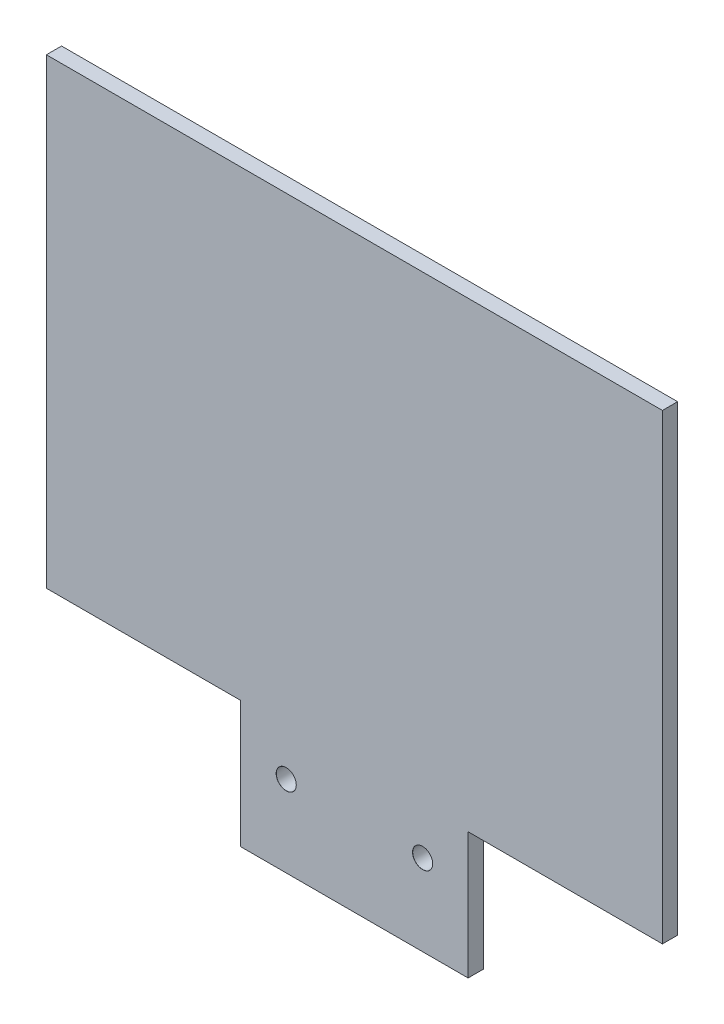
ISO-10303-21;
HEADER;
FILE_DESCRIPTION(('STEP AP214'),'2;1');
FILE_NAME('part.step','',(''),(''),'','','');
FILE_SCHEMA(('AUTOMOTIVE_DESIGN { 1 0 10303 214 1 1 1 1 }'));
ENDSEC;
DATA;
#1=APPLICATION_CONTEXT('core data for automotive mechanical design processes');
#2=APPLICATION_PROTOCOL_DEFINITION('international standard','automotive_design',2000,#1);
#3=PRODUCT_CONTEXT('',#1,'mechanical');
#4=PRODUCT('Part','Part','',(#3));
#5=PRODUCT_RELATED_PRODUCT_CATEGORY('part','',(#4));
#6=PRODUCT_DEFINITION_FORMATION('','',#4);
#7=PRODUCT_DEFINITION_CONTEXT('part definition',#1,'design');
#8=PRODUCT_DEFINITION('design','',#6,#7);
#9=PRODUCT_DEFINITION_SHAPE('','',#8);
#10=(LENGTH_UNIT() NAMED_UNIT(*) SI_UNIT(.MILLI.,.METRE.));
#11=(NAMED_UNIT(*) PLANE_ANGLE_UNIT() SI_UNIT($,.RADIAN.));
#12=(NAMED_UNIT(*) SI_UNIT($,.STERADIAN.) SOLID_ANGLE_UNIT());
#13=UNCERTAINTY_MEASURE_WITH_UNIT(LENGTH_MEASURE(1.E-05),#10,'distance_accuracy_value','');
#14=(GEOMETRIC_REPRESENTATION_CONTEXT(3) GLOBAL_UNCERTAINTY_ASSIGNED_CONTEXT((#13)) GLOBAL_UNIT_ASSIGNED_CONTEXT((#10,
#11,#12)) REPRESENTATION_CONTEXT('',''));
#15=CARTESIAN_POINT('',(0.,0.,0.));
#16=DIRECTION('',(0.,0.,1.));
#17=DIRECTION('',(1.,0.,0.));
#18=AXIS2_PLACEMENT_3D('',#15,#16,#17);
#19=CARTESIAN_POINT('',(0.,20.889,5.));
#20=DIRECTION('',(0.,-1.,0.));
#21=DIRECTION('',(1.,0.,0.));
#22=AXIS2_PLACEMENT_3D('',#19,#20,#21);
#23=PLANE('',#22);
#24=DIRECTION('',(-1.,0.,0.));
#25=VECTOR('',#24,1.);
#26=CARTESIAN_POINT('',(0.,20.889,0.));
#27=LINE('',#26,#25);
#28=CARTESIAN_POINT('',(-37.5,20.889,0.));
#29=VERTEX_POINT('',#28);
#30=CARTESIAN_POINT('',(-101.6,20.889,0.));
#31=VERTEX_POINT('',#30);
#32=EDGE_CURVE('E128',#29,#31,#27,.T.);
#33=ORIENTED_EDGE('',*,*,#32,.F.);
#34=DIRECTION('',(0.,0.,-1.));
#35=VECTOR('',#34,1.);
#36=CARTESIAN_POINT('',(-37.5,20.889,5.));
#37=LINE('',#36,#35);
#38=CARTESIAN_POINT('',(-37.5,20.889,5.));
#39=VERTEX_POINT('',#38);
#40=EDGE_CURVE('E11',#39,#29,#37,.T.);
#41=ORIENTED_EDGE('',*,*,#40,.F.);
#42=DIRECTION('',(-1.,0.,0.));
#43=VECTOR('',#42,1.);
#44=CARTESIAN_POINT('',(0.,20.889,5.));
#45=LINE('',#44,#43);
#46=CARTESIAN_POINT('',(-101.6,20.889,5.));
#47=VERTEX_POINT('',#46);
#48=EDGE_CURVE('E147',#39,#47,#45,.T.);
#49=ORIENTED_EDGE('',*,*,#48,.T.);
#50=DIRECTION('',(0.,0.,-1.));
#51=VECTOR('',#50,1.);
#52=CARTESIAN_POINT('',(-101.6,20.889,5.));
#53=LINE('',#52,#51);
#54=EDGE_CURVE('E86',#47,#31,#53,.T.);
#55=ORIENTED_EDGE('',*,*,#54,.T.);
#56=EDGE_LOOP('',(#33,#41,#49,#55));
#57=FACE_BOUND('',#56,.T.);
#58=ADVANCED_FACE('F36',(#57),#23,.T.);
#59=CARTESIAN_POINT('',(-37.5,0.,5.));
#60=DIRECTION('',(-1.,0.,0.));
#61=DIRECTION('',(0.,0.,1.));
#62=AXIS2_PLACEMENT_3D('',#59,#60,#61);
#63=PLANE('',#62);
#64=DIRECTION('',(0.,1.,0.));
#65=VECTOR('',#64,1.);
#66=CARTESIAN_POINT('',(-37.5,0.,0.));
#67=LINE('',#66,#65);
#68=CARTESIAN_POINT('',(-37.5,-20.889,0.));
#69=VERTEX_POINT('',#68);
#70=EDGE_CURVE('E131',#69,#29,#67,.T.);
#71=ORIENTED_EDGE('',*,*,#70,.F.);
#72=DIRECTION('',(0.,0.,-1.));
#73=VECTOR('',#72,1.);
#74=CARTESIAN_POINT('',(-37.5,-20.889,5.));
#75=LINE('',#74,#73);
#76=CARTESIAN_POINT('',(-37.5,-20.889,5.));
#77=VERTEX_POINT('',#76);
#78=EDGE_CURVE('E44',#77,#69,#75,.T.);
#79=ORIENTED_EDGE('',*,*,#78,.F.);
#80=DIRECTION('',(0.,1.,0.));
#81=VECTOR('',#80,1.);
#82=CARTESIAN_POINT('',(-37.5,0.,5.));
#83=LINE('',#82,#81);
#84=EDGE_CURVE('E171',#77,#39,#83,.T.);
#85=ORIENTED_EDGE('',*,*,#84,.T.);
#86=ORIENTED_EDGE('',*,*,#40,.T.);
#87=EDGE_LOOP('',(#71,#79,#85,#86));
#88=FACE_BOUND('',#87,.T.);
#89=ADVANCED_FACE('F170',(#88),#63,.T.);
#90=CARTESIAN_POINT('',(0.,-20.889,5.));
#91=DIRECTION('',(0.,1.,0.));
#92=DIRECTION('',(0.,0.,1.));
#93=AXIS2_PLACEMENT_3D('',#90,#91,#92);
#94=PLANE('',#93);
#95=DIRECTION('',(1.,0.,0.));
#96=VECTOR('',#95,1.);
#97=CARTESIAN_POINT('',(0.,-20.889,0.));
#98=LINE('',#97,#96);
#99=CARTESIAN_POINT('',(37.5,-20.889,0.));
#100=VERTEX_POINT('',#99);
#101=EDGE_CURVE('E135',#69,#100,#98,.T.);
#102=ORIENTED_EDGE('',*,*,#101,.T.);
#103=DIRECTION('',(0.,0.,-1.));
#104=VECTOR('',#103,1.);
#105=CARTESIAN_POINT('',(37.5,-20.889,5.));
#106=LINE('',#105,#104);
#107=CARTESIAN_POINT('',(37.5,-20.889,5.));
#108=VERTEX_POINT('',#107);
#109=EDGE_CURVE('E154',#108,#100,#106,.T.);
#110=ORIENTED_EDGE('',*,*,#109,.F.);
#111=DIRECTION('',(1.,0.,0.));
#112=VECTOR('',#111,1.);
#113=CARTESIAN_POINT('',(0.,-20.889,5.));
#114=LINE('',#113,#112);
#115=EDGE_CURVE('E161',#77,#108,#114,.T.);
#116=ORIENTED_EDGE('',*,*,#115,.F.);
#117=ORIENTED_EDGE('',*,*,#78,.T.);
#118=EDGE_LOOP('',(#102,#110,#116,#117));
#119=FACE_BOUND('',#118,.T.);
#120=ADVANCED_FACE('F159',(#119),#94,.F.);
#121=CARTESIAN_POINT('',(37.5,0.,5.));
#122=DIRECTION('',(-1.,0.,0.));
#123=DIRECTION('',(0.,-1.,0.));
#124=AXIS2_PLACEMENT_3D('',#121,#122,#123);
#125=PLANE('',#124);
#126=DIRECTION('',(0.,1.,0.));
#127=VECTOR('',#126,1.);
#128=CARTESIAN_POINT('',(37.5,0.,0.));
#129=LINE('',#128,#127);
#130=CARTESIAN_POINT('',(37.5,20.889,0.));
#131=VERTEX_POINT('',#130);
#132=EDGE_CURVE('E137',#100,#131,#129,.T.);
#133=ORIENTED_EDGE('',*,*,#132,.T.);
#134=DIRECTION('',(0.,0.,-1.));
#135=VECTOR('',#134,1.);
#136=CARTESIAN_POINT('',(37.5,20.889,5.));
#137=LINE('',#136,#135);
#138=CARTESIAN_POINT('',(37.5,20.889,5.));
#139=VERTEX_POINT('',#138);
#140=EDGE_CURVE('E151',#139,#131,#137,.T.);
#141=ORIENTED_EDGE('',*,*,#140,.F.);
#142=DIRECTION('',(0.,1.,0.));
#143=VECTOR('',#142,1.);
#144=CARTESIAN_POINT('',(37.5,0.,5.));
#145=LINE('',#144,#143);
#146=EDGE_CURVE('E179',#108,#139,#145,.T.);
#147=ORIENTED_EDGE('',*,*,#146,.F.);
#148=ORIENTED_EDGE('',*,*,#109,.T.);
#149=EDGE_LOOP('',(#133,#141,#147,#148));
#150=FACE_BOUND('',#149,.T.);
#151=ADVANCED_FACE('F183',(#150),#125,.F.);
#152=CARTESIAN_POINT('',(0.,20.889,5.));
#153=DIRECTION('',(0.,1.,0.));
#154=DIRECTION('',(0.,0.,1.));
#155=AXIS2_PLACEMENT_3D('',#152,#153,#154);
#156=PLANE('',#155);
#157=DIRECTION('',(1.,0.,0.));
#158=VECTOR('',#157,1.);
#159=CARTESIAN_POINT('',(0.,20.889,0.));
#160=LINE('',#159,#158);
#161=CARTESIAN_POINT('',(101.6,20.889,0.));
#162=VERTEX_POINT('',#161);
#163=EDGE_CURVE('E139',#131,#162,#160,.T.);
#164=ORIENTED_EDGE('',*,*,#163,.T.);
#165=DIRECTION('',(0.,0.,-1.));
#166=VECTOR('',#165,1.);
#167=CARTESIAN_POINT('',(101.6,20.889,5.));
#168=LINE('',#167,#166);
#169=CARTESIAN_POINT('',(101.6,20.889,5.));
#170=VERTEX_POINT('',#169);
#171=EDGE_CURVE('E115',#170,#162,#168,.T.);
#172=ORIENTED_EDGE('',*,*,#171,.F.);
#173=DIRECTION('',(1.,0.,0.));
#174=VECTOR('',#173,1.);
#175=CARTESIAN_POINT('',(0.,20.889,5.));
#176=LINE('',#175,#174);
#177=EDGE_CURVE('E120',#139,#170,#176,.T.);
#178=ORIENTED_EDGE('',*,*,#177,.F.);
#179=ORIENTED_EDGE('',*,*,#140,.T.);
#180=EDGE_LOOP('',(#164,#172,#178,#179));
#181=FACE_BOUND('',#180,.T.);
#182=ADVANCED_FACE('F185',(#181),#156,.F.);
#183=CARTESIAN_POINT('',(101.6,0.,5.));
#184=DIRECTION('',(1.,0.,0.));
#185=DIRECTION('',(0.,1.,0.));
#186=AXIS2_PLACEMENT_3D('',#183,#184,#185);
#187=PLANE('',#186);
#188=DIRECTION('',(0.,-1.,0.));
#189=VECTOR('',#188,1.);
#190=CARTESIAN_POINT('',(101.6,0.,0.));
#191=LINE('',#190,#189);
#192=CARTESIAN_POINT('',(101.6,173.289,0.));
#193=VERTEX_POINT('',#192);
#194=EDGE_CURVE('E110',#193,#162,#191,.T.);
#195=ORIENTED_EDGE('',*,*,#194,.F.);
#196=DIRECTION('',(0.,0.,-1.));
#197=VECTOR('',#196,1.);
#198=CARTESIAN_POINT('',(101.6,173.289,5.));
#199=LINE('',#198,#197);
#200=CARTESIAN_POINT('',(101.6,173.289,5.));
#201=VERTEX_POINT('',#200);
#202=EDGE_CURVE('E105',#201,#193,#199,.T.);
#203=ORIENTED_EDGE('',*,*,#202,.F.);
#204=DIRECTION('',(0.,-1.,0.));
#205=VECTOR('',#204,1.);
#206=CARTESIAN_POINT('',(101.6,0.,5.));
#207=LINE('',#206,#205);
#208=EDGE_CURVE('E108',#201,#170,#207,.T.);
#209=ORIENTED_EDGE('',*,*,#208,.T.);
#210=ORIENTED_EDGE('',*,*,#171,.T.);
#211=EDGE_LOOP('',(#195,#203,#209,#210));
#212=FACE_BOUND('',#211,.T.);
#213=ADVANCED_FACE('F107',(#212),#187,.T.);
#214=CARTESIAN_POINT('',(0.,173.289,5.));
#215=DIRECTION('',(0.,1.,0.));
#216=DIRECTION('',(0.,0.,1.));
#217=AXIS2_PLACEMENT_3D('',#214,#215,#216);
#218=PLANE('',#217);
#219=DIRECTION('',(1.,0.,0.));
#220=VECTOR('',#219,1.);
#221=CARTESIAN_POINT('',(0.,173.289,0.));
#222=LINE('',#221,#220);
#223=CARTESIAN_POINT('',(-101.6,173.289,0.));
#224=VERTEX_POINT('',#223);
#225=EDGE_CURVE('E143',#224,#193,#222,.T.);
#226=ORIENTED_EDGE('',*,*,#225,.F.);
#227=DIRECTION('',(0.,0.,-1.));
#228=VECTOR('',#227,1.);
#229=CARTESIAN_POINT('',(-101.6,173.289,5.));
#230=LINE('',#229,#228);
#231=CARTESIAN_POINT('',(-101.6,173.289,5.));
#232=VERTEX_POINT('',#231);
#233=EDGE_CURVE('E79',#232,#224,#230,.T.);
#234=ORIENTED_EDGE('',*,*,#233,.F.);
#235=DIRECTION('',(1.,0.,0.));
#236=VECTOR('',#235,1.);
#237=CARTESIAN_POINT('',(0.,173.289,5.));
#238=LINE('',#237,#236);
#239=EDGE_CURVE('E118',#232,#201,#238,.T.);
#240=ORIENTED_EDGE('',*,*,#239,.T.);
#241=ORIENTED_EDGE('',*,*,#202,.T.);
#242=EDGE_LOOP('',(#226,#234,#240,#241));
#243=FACE_BOUND('',#242,.T.);
#244=ADVANCED_FACE('F123',(#243),#218,.T.);
#245=CARTESIAN_POINT('',(-101.6,0.,5.));
#246=DIRECTION('',(1.,0.,0.));
#247=DIRECTION('',(0.,1.,0.));
#248=AXIS2_PLACEMENT_3D('',#245,#246,#247);
#249=PLANE('',#248);
#250=DIRECTION('',(0.,-1.,0.));
#251=VECTOR('',#250,1.);
#252=CARTESIAN_POINT('',(-101.6,0.,0.));
#253=LINE('',#252,#251);
#254=EDGE_CURVE('E145',#224,#31,#253,.T.);
#255=ORIENTED_EDGE('',*,*,#254,.T.);
#256=ORIENTED_EDGE('',*,*,#54,.F.);
#257=DIRECTION('',(0.,-1.,0.));
#258=VECTOR('',#257,1.);
#259=CARTESIAN_POINT('',(-101.6,0.,5.));
#260=LINE('',#259,#258);
#261=EDGE_CURVE('E52',#232,#47,#260,.T.);
#262=ORIENTED_EDGE('',*,*,#261,.F.);
#263=ORIENTED_EDGE('',*,*,#233,.T.);
#264=EDGE_LOOP('',(#255,#256,#262,#263));
#265=FACE_BOUND('',#264,.T.);
#266=ADVANCED_FACE('F172',(#265),#249,.F.);
#267=CARTESIAN_POINT('',(0.,0.,5.));
#268=DIRECTION('',(0.,0.,1.));
#269=DIRECTION('',(1.,0.,0.));
#270=AXIS2_PLACEMENT_3D('',#267,#268,#269);
#271=PLANE('',#270);
#272=CARTESIAN_POINT('',(-22.5,5.889,5.));
#273=DIRECTION('',(0.,0.,1.));
#274=DIRECTION('',(1.,0.,0.));
#275=AXIS2_PLACEMENT_3D('',#272,#273,#274);
#276=CIRCLE('',#275,3.325);
#277=CARTESIAN_POINT('',(-19.175,5.889,5.));
#278=VERTEX_POINT('',#277);
#279=EDGE_CURVE('E303',#278,#278,#276,.T.);
#280=ORIENTED_EDGE('',*,*,#279,.F.);
#281=EDGE_LOOP('',(#280));
#282=FACE_BOUND('',#281,.T.);
#283=CARTESIAN_POINT('',(22.5,5.889,5.));
#284=DIRECTION('',(0.,0.,1.));
#285=DIRECTION('',(1.,0.,0.));
#286=AXIS2_PLACEMENT_3D('',#283,#284,#285);
#287=CIRCLE('',#286,3.325);
#288=CARTESIAN_POINT('',(25.825,5.889,5.));
#289=VERTEX_POINT('',#288);
#290=EDGE_CURVE('E310',#289,#289,#287,.T.);
#291=ORIENTED_EDGE('',*,*,#290,.F.);
#292=EDGE_LOOP('',(#291));
#293=FACE_BOUND('',#292,.T.);
#294=ORIENTED_EDGE('',*,*,#48,.F.);
#295=ORIENTED_EDGE('',*,*,#84,.F.);
#296=ORIENTED_EDGE('',*,*,#115,.T.);
#297=ORIENTED_EDGE('',*,*,#146,.T.);
#298=ORIENTED_EDGE('',*,*,#177,.T.);
#299=ORIENTED_EDGE('',*,*,#208,.F.);
#300=ORIENTED_EDGE('',*,*,#239,.F.);
#301=ORIENTED_EDGE('',*,*,#261,.T.);
#302=EDGE_LOOP('',(#294,#295,#296,#297,#298,#299,#300,#301));
#303=FACE_BOUND('',#302,.T.);
#304=ADVANCED_FACE('F117',(#282,#293,#303),#271,.T.);
#305=CARTESIAN_POINT('',(0.,0.,0.));
#306=DIRECTION('',(0.,0.,1.));
#307=DIRECTION('',(1.,0.,0.));
#308=AXIS2_PLACEMENT_3D('',#305,#306,#307);
#309=PLANE('',#308);
#310=CARTESIAN_POINT('',(-22.5,5.889,0.));
#311=DIRECTION('',(0.,0.,1.));
#312=DIRECTION('',(1.,0.,0.));
#313=AXIS2_PLACEMENT_3D('',#310,#311,#312);
#314=CIRCLE('',#313,3.29999999999999);
#315=CARTESIAN_POINT('',(-19.2,5.889,0.));
#316=VERTEX_POINT('',#315);
#317=EDGE_CURVE('E305',#316,#316,#314,.T.);
#318=ORIENTED_EDGE('',*,*,#317,.T.);
#319=EDGE_LOOP('',(#318));
#320=FACE_BOUND('',#319,.T.);
#321=CARTESIAN_POINT('',(22.5,5.889,0.));
#322=DIRECTION('',(0.,0.,1.));
#323=DIRECTION('',(1.,0.,0.));
#324=AXIS2_PLACEMENT_3D('',#321,#322,#323);
#325=CIRCLE('',#324,3.29999999999999);
#326=CARTESIAN_POINT('',(25.8,5.889,0.));
#327=VERTEX_POINT('',#326);
#328=EDGE_CURVE('E132',#327,#327,#325,.T.);
#329=ORIENTED_EDGE('',*,*,#328,.T.);
#330=EDGE_LOOP('',(#329));
#331=FACE_BOUND('',#330,.T.);
#332=ORIENTED_EDGE('',*,*,#32,.T.);
#333=ORIENTED_EDGE('',*,*,#254,.F.);
#334=ORIENTED_EDGE('',*,*,#225,.T.);
#335=ORIENTED_EDGE('',*,*,#194,.T.);
#336=ORIENTED_EDGE('',*,*,#163,.F.);
#337=ORIENTED_EDGE('',*,*,#132,.F.);
#338=ORIENTED_EDGE('',*,*,#101,.F.);
#339=ORIENTED_EDGE('',*,*,#70,.T.);
#340=EDGE_LOOP('',(#332,#333,#334,#335,#336,#337,#338,#339));
#341=FACE_BOUND('',#340,.T.);
#342=ADVANCED_FACE('F168',(#320,#331,#341),#309,.F.);
#343=CARTESIAN_POINT('',(22.5,5.889,5.));
#344=DIRECTION('',(0.,0.,1.));
#345=DIRECTION('',(1.,0.,0.));
#346=AXIS2_PLACEMENT_3D('',#343,#344,#345);
#347=CYLINDRICAL_SURFACE('',#346,3.29999999999999);
#348=ORIENTED_EDGE('',*,*,#328,.F.);
#349=EDGE_LOOP('',(#348));
#350=FACE_BOUND('',#349,.T.);
#351=CARTESIAN_POINT('',(22.5,5.889,4.975));
#352=DIRECTION('',(0.,0.,1.));
#353=DIRECTION('',(1.,0.,0.));
#354=AXIS2_PLACEMENT_3D('',#351,#352,#353);
#355=CIRCLE('',#354,3.29999999999999);
#356=CARTESIAN_POINT('',(25.8,5.889,4.975));
#357=VERTEX_POINT('',#356);
#358=EDGE_CURVE('E312',#357,#357,#355,.T.);
#359=ORIENTED_EDGE('',*,*,#358,.T.);
#360=EDGE_LOOP('',(#359));
#361=FACE_BOUND('',#360,.T.);
#362=ADVANCED_FACE('F253',(#350,#361),#347,.F.);
#363=CARTESIAN_POINT('',(22.5,5.889,5.));
#364=DIRECTION('',(0.,0.,1.));
#365=DIRECTION('',(1.,0.,0.));
#366=AXIS2_PLACEMENT_3D('',#363,#364,#365);
#367=CONICAL_SURFACE('',#366,3.325,0.78539816339776);
#368=ORIENTED_EDGE('',*,*,#358,.F.);
#369=EDGE_LOOP('',(#368));
#370=FACE_BOUND('',#369,.T.);
#371=ORIENTED_EDGE('',*,*,#290,.T.);
#372=EDGE_LOOP('',(#371));
#373=FACE_BOUND('',#372,.T.);
#374=ADVANCED_FACE('F263',(#370,#373),#367,.F.);
#375=CARTESIAN_POINT('',(-22.5,5.889,5.));
#376=DIRECTION('',(0.,0.,1.));
#377=DIRECTION('',(1.,0.,0.));
#378=AXIS2_PLACEMENT_3D('',#375,#376,#377);
#379=CYLINDRICAL_SURFACE('',#378,3.29999999999999);
#380=ORIENTED_EDGE('',*,*,#317,.F.);
#381=EDGE_LOOP('',(#380));
#382=FACE_BOUND('',#381,.T.);
#383=CARTESIAN_POINT('',(-22.5,5.889,4.975));
#384=DIRECTION('',(0.,0.,1.));
#385=DIRECTION('',(1.,0.,0.));
#386=AXIS2_PLACEMENT_3D('',#383,#384,#385);
#387=CIRCLE('',#386,3.29999999999999);
#388=CARTESIAN_POINT('',(-19.2,5.889,4.975));
#389=VERTEX_POINT('',#388);
#390=EDGE_CURVE('E300',#389,#389,#387,.T.);
#391=ORIENTED_EDGE('',*,*,#390,.T.);
#392=EDGE_LOOP('',(#391));
#393=FACE_BOUND('',#392,.T.);
#394=ADVANCED_FACE('F273',(#382,#393),#379,.F.);
#395=CARTESIAN_POINT('',(-22.5,5.889,5.));
#396=DIRECTION('',(0.,0.,1.));
#397=DIRECTION('',(1.,0.,0.));
#398=AXIS2_PLACEMENT_3D('',#395,#396,#397);
#399=CONICAL_SURFACE('',#398,3.325,0.78539816339776);
#400=ORIENTED_EDGE('',*,*,#390,.F.);
#401=EDGE_LOOP('',(#400));
#402=FACE_BOUND('',#401,.T.);
#403=ORIENTED_EDGE('',*,*,#279,.T.);
#404=EDGE_LOOP('',(#403));
#405=FACE_BOUND('',#404,.T.);
#406=ADVANCED_FACE('F283',(#402,#405),#399,.F.);
#407=CLOSED_SHELL('',(#58,#89,#120,#151,#182,#213,#244,#266,#304,#342,#362,#374,#394,#406));
#408=MANIFOLD_SOLID_BREP('B2',#407);
#409=ADVANCED_BREP_SHAPE_REPRESENTATION('',(#18,#408),#14);
#410=SHAPE_DEFINITION_REPRESENTATION(#9,#409);
ENDSEC;
END-ISO-10303-21;
